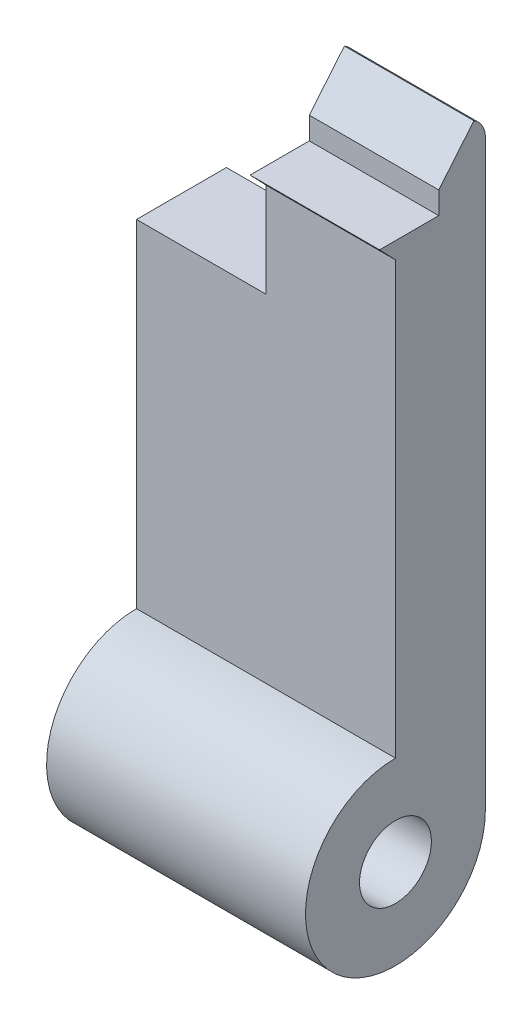
ISO-10303-21;
HEADER;
FILE_DESCRIPTION(('STEP AP214'),'2;1');
FILE_NAME('part.step','',(''),(''),'','','');
FILE_SCHEMA(('AUTOMOTIVE_DESIGN { 1 0 10303 214 1 1 1 1 }'));
ENDSEC;
DATA;
#1=APPLICATION_CONTEXT('core data for automotive mechanical design processes');
#2=APPLICATION_PROTOCOL_DEFINITION('international standard','automotive_design',2000,#1);
#3=PRODUCT_CONTEXT('',#1,'mechanical');
#4=PRODUCT('Part','Part','',(#3));
#5=PRODUCT_RELATED_PRODUCT_CATEGORY('part','',(#4));
#6=PRODUCT_DEFINITION_FORMATION('','',#4);
#7=PRODUCT_DEFINITION_CONTEXT('part definition',#1,'design');
#8=PRODUCT_DEFINITION('design','',#6,#7);
#9=PRODUCT_DEFINITION_SHAPE('','',#8);
#10=(LENGTH_UNIT() NAMED_UNIT(*) SI_UNIT(.MILLI.,.METRE.));
#11=(NAMED_UNIT(*) PLANE_ANGLE_UNIT() SI_UNIT($,.RADIAN.));
#12=(NAMED_UNIT(*) SI_UNIT($,.STERADIAN.) SOLID_ANGLE_UNIT());
#13=UNCERTAINTY_MEASURE_WITH_UNIT(LENGTH_MEASURE(1.E-05),#10,'distance_accuracy_value','');
#14=(GEOMETRIC_REPRESENTATION_CONTEXT(3) GLOBAL_UNCERTAINTY_ASSIGNED_CONTEXT((#13)) GLOBAL_UNIT_ASSIGNED_CONTEXT((#10,
#11,#12)) REPRESENTATION_CONTEXT('',''));
#15=CARTESIAN_POINT('',(0.,0.,0.));
#16=DIRECTION('',(0.,0.,1.));
#17=DIRECTION('',(1.,0.,0.));
#18=AXIS2_PLACEMENT_3D('',#15,#16,#17);
#19=CARTESIAN_POINT('',(9.144,0.,-1.52985296960418));
#20=DIRECTION('',(0.,0.,1.));
#21=DIRECTION('',(1.,0.,0.));
#22=AXIS2_PLACEMENT_3D('',#19,#20,#21);
#23=PLANE('',#22);
#24=DIRECTION('',(0.,1.,0.));
#25=VECTOR('',#24,1.);
#26=CARTESIAN_POINT('',(4.572,0.,-1.52985296960418));
#27=LINE('',#26,#25);
#28=CARTESIAN_POINT('',(4.572,19.000960284167,-1.52985296960418));
#29=VERTEX_POINT('',#28);
#30=CARTESIAN_POINT('',(4.572,19.7874801420835,-1.52985296960417));
#31=VERTEX_POINT('',#30);
#32=EDGE_CURVE('E187',#29,#31,#27,.T.);
#33=ORIENTED_EDGE('',*,*,#32,.F.);
#34=DIRECTION('',(-1.,0.,0.));
#35=VECTOR('',#34,1.);
#36=CARTESIAN_POINT('',(9.144,19.000960284167,-1.52985296960418));
#37=LINE('',#36,#35);
#38=CARTESIAN_POINT('',(9.144,19.000960284167,-1.52985296960418));
#39=VERTEX_POINT('',#38);
#40=EDGE_CURVE('E83',#39,#29,#37,.T.);
#41=ORIENTED_EDGE('',*,*,#40,.F.);
#42=DIRECTION('',(0.,1.,0.));
#43=VECTOR('',#42,1.);
#44=CARTESIAN_POINT('',(9.144,0.,-1.52985296960418));
#45=LINE('',#44,#43);
#46=CARTESIAN_POINT('',(9.144,19.7874801420835,-1.52985296960418));
#47=VERTEX_POINT('',#46);
#48=EDGE_CURVE('E144',#39,#47,#45,.T.);
#49=ORIENTED_EDGE('',*,*,#48,.T.);
#50=DIRECTION('',(-1.,0.,0.));
#51=VECTOR('',#50,1.);
#52=CARTESIAN_POINT('',(9.144,19.7874801420835,-1.52985296960418));
#53=LINE('',#52,#51);
#54=EDGE_CURVE('E132',#47,#31,#53,.T.);
#55=ORIENTED_EDGE('',*,*,#54,.T.);
#56=EDGE_LOOP('',(#33,#41,#49,#55));
#57=FACE_BOUND('',#56,.T.);
#58=ADVANCED_FACE('F35',(#57),#23,.T.);
#59=CARTESIAN_POINT('',(9.144,19.000960284167,0.));
#60=DIRECTION('',(0.,-1.,0.));
#61=DIRECTION('',(0.,0.,-1.));
#62=AXIS2_PLACEMENT_3D('',#59,#60,#61);
#63=PLANE('',#62);
#64=ORIENTED_EDGE('',*,*,#40,.T.);
#65=DIRECTION('',(0.,0.,1.));
#66=VECTOR('',#65,1.);
#67=CARTESIAN_POINT('',(4.572,19.000960284167,0.));
#68=LINE('',#67,#66);
#69=CARTESIAN_POINT('',(4.572,19.000960284167,0.561351088179941));
#70=VERTEX_POINT('',#69);
#71=EDGE_CURVE('E184',#29,#70,#68,.T.);
#72=ORIENTED_EDGE('',*,*,#71,.T.);
#73=DIRECTION('',(-1.,0.,0.));
#74=VECTOR('',#73,1.);
#75=CARTESIAN_POINT('',(9.144,19.000960284167,0.561351088179941));
#76=LINE('',#75,#74);
#77=CARTESIAN_POINT('',(9.144,19.000960284167,0.561351088179941));
#78=VERTEX_POINT('',#77);
#79=EDGE_CURVE('E154',#78,#70,#76,.T.);
#80=ORIENTED_EDGE('',*,*,#79,.F.);
#81=DIRECTION('',(0.,0.,1.));
#82=VECTOR('',#81,1.);
#83=CARTESIAN_POINT('',(9.144,19.000960284167,0.));
#84=LINE('',#83,#82);
#85=EDGE_CURVE('E174',#39,#78,#84,.T.);
#86=ORIENTED_EDGE('',*,*,#85,.F.);
#87=EDGE_LOOP('',(#64,#72,#80,#86));
#88=FACE_BOUND('',#87,.T.);
#89=ADVANCED_FACE('F228',(#88),#63,.F.);
#90=CARTESIAN_POINT('',(9.144,8.81269005290307,-9.19903154444387));
#91=DIRECTION('',(0.,-0.691780612318571,0.722107737404982));
#92=DIRECTION('',(0.,-0.722107737404982,-0.691780612318571));
#93=AXIS2_PLACEMENT_3D('',#90,#91,#92);
#94=PLANE('',#93);
#95=DIRECTION('',(0.,0.722107737404982,0.691780612318571));
#96=VECTOR('',#95,1.);
#97=CARTESIAN_POINT('',(4.572,8.81269005290307,-9.19903154444387));
#98=LINE('',#97,#96);
#99=CARTESIAN_POINT('',(4.572,18.415,0.));
#100=VERTEX_POINT('',#99);
#101=EDGE_CURVE('E181',#100,#70,#98,.T.);
#102=ORIENTED_EDGE('',*,*,#101,.F.);
#103=DIRECTION('',(-1.,0.,0.));
#104=VECTOR('',#103,1.);
#105=CARTESIAN_POINT('',(9.144,18.415,0.));
#106=LINE('',#105,#104);
#107=CARTESIAN_POINT('',(9.144,18.415,0.));
#108=VERTEX_POINT('',#107);
#109=EDGE_CURVE('E151',#108,#100,#106,.T.);
#110=ORIENTED_EDGE('',*,*,#109,.F.);
#111=DIRECTION('',(0.,0.722107737404982,0.691780612318571));
#112=VECTOR('',#111,1.);
#113=CARTESIAN_POINT('',(9.144,8.81269005290307,-9.19903154444387));
#114=LINE('',#113,#112);
#115=EDGE_CURVE('E171',#108,#78,#114,.T.);
#116=ORIENTED_EDGE('',*,*,#115,.T.);
#117=ORIENTED_EDGE('',*,*,#79,.T.);
#118=EDGE_LOOP('',(#102,#110,#116,#117));
#119=FACE_BOUND('',#118,.T.);
#120=ADVANCED_FACE('F218',(#119),#94,.T.);
#121=CARTESIAN_POINT('',(9.144,0.,0.));
#122=DIRECTION('',(0.,0.,1.));
#123=DIRECTION('',(1.,0.,0.));
#124=AXIS2_PLACEMENT_3D('',#121,#122,#123);
#125=PLANE('',#124);
#126=DIRECTION('',(0.,1.,0.));
#127=VECTOR('',#126,1.);
#128=CARTESIAN_POINT('',(4.572,0.,0.));
#129=LINE('',#128,#127);
#130=CARTESIAN_POINT('',(4.572,15.0775690128072,0.));
#131=VERTEX_POINT('',#130);
#132=EDGE_CURVE('E136',#131,#100,#129,.T.);
#133=ORIENTED_EDGE('',*,*,#132,.F.);
#134=DIRECTION('',(1.,0.,0.));
#135=VECTOR('',#134,1.);
#136=CARTESIAN_POINT('',(9.144,15.0775690128072,0.));
#137=LINE('',#136,#135);
#138=CARTESIAN_POINT('',(0.,15.0775690128072,0.));
#139=VERTEX_POINT('',#138);
#140=EDGE_CURVE('E193',#139,#131,#137,.T.);
#141=ORIENTED_EDGE('',*,*,#140,.F.);
#142=DIRECTION('',(0.,1.,0.));
#143=VECTOR('',#142,1.);
#144=CARTESIAN_POINT('',(0.,0.,0.));
#145=LINE('',#144,#143);
#146=CARTESIAN_POINT('',(0.,3.175,0.));
#147=VERTEX_POINT('',#146);
#148=EDGE_CURVE('E133',#147,#139,#145,.T.);
#149=ORIENTED_EDGE('',*,*,#148,.F.);
#150=DIRECTION('',(-1.,0.,0.));
#151=VECTOR('',#150,1.);
#152=CARTESIAN_POINT('',(9.144,3.175,0.));
#153=LINE('',#152,#151);
#154=CARTESIAN_POINT('',(9.144,3.175,0.));
#155=VERTEX_POINT('',#154);
#156=EDGE_CURVE('E149',#155,#147,#153,.T.);
#157=ORIENTED_EDGE('',*,*,#156,.F.);
#158=DIRECTION('',(0.,1.,0.));
#159=VECTOR('',#158,1.);
#160=CARTESIAN_POINT('',(9.144,0.,0.));
#161=LINE('',#160,#159);
#162=EDGE_CURVE('E167',#155,#108,#161,.T.);
#163=ORIENTED_EDGE('',*,*,#162,.T.);
#164=ORIENTED_EDGE('',*,*,#109,.T.);
#165=EDGE_LOOP('',(#133,#141,#149,#157,#163,#164));
#166=FACE_BOUND('',#165,.T.);
#167=ADVANCED_FACE('F220',(#166),#125,.T.);
#168=CARTESIAN_POINT('',(9.144,0.,0.));
#169=DIRECTION('',(-1.,0.,0.));
#170=DIRECTION('',(0.,0.,1.));
#171=AXIS2_PLACEMENT_3D('',#168,#169,#170);
#172=CYLINDRICAL_SURFACE('',#171,3.175);
#173=CARTESIAN_POINT('',(0.,0.,0.));
#174=DIRECTION('',(1.,0.,0.));
#175=DIRECTION('',(0.,0.,-1.));
#176=AXIS2_PLACEMENT_3D('',#173,#174,#175);
#177=CIRCLE('',#176,3.175);
#178=CARTESIAN_POINT('',(0.,0.,-3.175));
#179=VERTEX_POINT('',#178);
#180=EDGE_CURVE('E74',#147,#179,#177,.T.);
#181=ORIENTED_EDGE('',*,*,#180,.T.);
#182=DIRECTION('',(-1.,0.,0.));
#183=VECTOR('',#182,1.);
#184=CARTESIAN_POINT('',(9.144,0.,-3.175));
#185=LINE('',#184,#183);
#186=CARTESIAN_POINT('',(9.144,0.,-3.175));
#187=VERTEX_POINT('',#186);
#188=EDGE_CURVE('E120',#187,#179,#185,.T.);
#189=ORIENTED_EDGE('',*,*,#188,.F.);
#190=CARTESIAN_POINT('',(9.144,0.,0.));
#191=DIRECTION('',(1.,0.,0.));
#192=DIRECTION('',(0.,0.,-1.));
#193=AXIS2_PLACEMENT_3D('',#190,#191,#192);
#194=CIRCLE('',#193,3.175);
#195=EDGE_CURVE('E108',#155,#187,#194,.T.);
#196=ORIENTED_EDGE('',*,*,#195,.F.);
#197=ORIENTED_EDGE('',*,*,#156,.T.);
#198=EDGE_LOOP('',(#181,#189,#196,#197));
#199=FACE_BOUND('',#198,.T.);
#200=ADVANCED_FACE('F166',(#199),#172,.T.);
#201=CARTESIAN_POINT('',(9.144,0.,-3.175));
#202=DIRECTION('',(0.,0.,1.));
#203=DIRECTION('',(1.,0.,0.));
#204=AXIS2_PLACEMENT_3D('',#201,#202,#203);
#205=PLANE('',#204);
#206=DIRECTION('',(-1.,0.,0.));
#207=VECTOR('',#206,1.);
#208=CARTESIAN_POINT('',(4.572,15.0775690128072,-3.175));
#209=LINE('',#208,#207);
#210=CARTESIAN_POINT('',(4.572,15.0775690128072,-3.175));
#211=VERTEX_POINT('',#210);
#212=CARTESIAN_POINT('',(0.,15.0775690128072,-3.175));
#213=VERTEX_POINT('',#212);
#214=EDGE_CURVE('E49',#211,#213,#209,.T.);
#215=ORIENTED_EDGE('',*,*,#214,.F.);
#216=DIRECTION('',(0.,-1.,0.));
#217=VECTOR('',#216,1.);
#218=CARTESIAN_POINT('',(4.572,22.586192510525,-3.175));
#219=LINE('',#218,#217);
#220=CARTESIAN_POINT('',(4.572,20.574,-3.175));
#221=VERTEX_POINT('',#220);
#222=EDGE_CURVE('E117',#221,#211,#219,.T.);
#223=ORIENTED_EDGE('',*,*,#222,.F.);
#224=DIRECTION('',(-1.,0.,0.));
#225=VECTOR('',#224,1.);
#226=CARTESIAN_POINT('',(9.144,20.574,-3.175));
#227=LINE('',#226,#225);
#228=CARTESIAN_POINT('',(9.144,20.574,-3.175));
#229=VERTEX_POINT('',#228);
#230=EDGE_CURVE('E113',#229,#221,#227,.T.);
#231=ORIENTED_EDGE('',*,*,#230,.F.);
#232=DIRECTION('',(0.,1.,0.));
#233=VECTOR('',#232,1.);
#234=CARTESIAN_POINT('',(9.144,0.,-3.175));
#235=LINE('',#234,#233);
#236=EDGE_CURVE('E100',#187,#229,#235,.T.);
#237=ORIENTED_EDGE('',*,*,#236,.F.);
#238=ORIENTED_EDGE('',*,*,#188,.T.);
#239=DIRECTION('',(0.,1.,0.));
#240=VECTOR('',#239,1.);
#241=CARTESIAN_POINT('',(0.,0.,-3.175));
#242=LINE('',#241,#240);
#243=EDGE_CURVE('E138',#179,#213,#242,.T.);
#244=ORIENTED_EDGE('',*,*,#243,.T.);
#245=EDGE_LOOP('',(#215,#223,#231,#237,#238,#244));
#246=FACE_BOUND('',#245,.T.);
#247=ADVANCED_FACE('F114',(#246),#205,.F.);
#248=CARTESIAN_POINT('',(9.144,20.574,-2.35242648480209));
#249=DIRECTION('',(-1.,0.,0.));
#250=DIRECTION('',(0.,0.,1.));
#251=AXIS2_PLACEMENT_3D('',#248,#249,#250);
#252=CYLINDRICAL_SURFACE('',#251,0.822573515197912);
#253=CARTESIAN_POINT('',(4.572,20.574,-2.35242648480209));
#254=DIRECTION('',(1.,0.,0.));
#255=DIRECTION('',(0.,0.,-1.));
#256=AXIS2_PLACEMENT_3D('',#253,#254,#255);
#257=CIRCLE('',#256,0.822573515197912);
#258=CARTESIAN_POINT('',(4.572,21.2824031479205,-2.77050801742632));
#259=VERTEX_POINT('',#258);
#260=EDGE_CURVE('E190',#259,#221,#257,.F.);
#261=ORIENTED_EDGE('',*,*,#260,.F.);
#262=DIRECTION('',(-1.,0.,0.));
#263=VECTOR('',#262,1.);
#264=CARTESIAN_POINT('',(9.144,21.2824031479205,-2.77050801742632));
#265=LINE('',#264,#263);
#266=CARTESIAN_POINT('',(9.144,21.2824031479205,-2.77050801742632));
#267=VERTEX_POINT('',#266);
#268=EDGE_CURVE('E121',#267,#259,#265,.T.);
#269=ORIENTED_EDGE('',*,*,#268,.F.);
#270=CARTESIAN_POINT('',(9.144,20.574,-2.35242648480209));
#271=DIRECTION('',(1.,0.,0.));
#272=DIRECTION('',(0.,0.,-1.));
#273=AXIS2_PLACEMENT_3D('',#270,#271,#272);
#274=CIRCLE('',#273,0.822573515197912);
#275=EDGE_CURVE('E105',#267,#229,#274,.F.);
#276=ORIENTED_EDGE('',*,*,#275,.T.);
#277=ORIENTED_EDGE('',*,*,#230,.T.);
#278=EDGE_LOOP('',(#261,#269,#276,#277));
#279=FACE_BOUND('',#278,.T.);
#280=ADVANCED_FACE('F123',(#279),#252,.T.);
#281=CARTESIAN_POINT('',(9.144,7.31845393063113,8.81834573378265));
#282=DIRECTION('',(0.,-0.638629481227086,-0.769514383041424));
#283=DIRECTION('',(0.,0.769514383041424,-0.638629481227086));
#284=AXIS2_PLACEMENT_3D('',#281,#282,#283);
#285=PLANE('',#284);
#286=ORIENTED_EDGE('',*,*,#268,.T.);
#287=DIRECTION('',(0.,-0.769514383041424,0.638629481227086));
#288=VECTOR('',#287,1.);
#289=CARTESIAN_POINT('',(4.572,7.31845393063113,8.81834573378265));
#290=LINE('',#289,#288);
#291=EDGE_CURVE('E11',#259,#31,#290,.T.);
#292=ORIENTED_EDGE('',*,*,#291,.T.);
#293=ORIENTED_EDGE('',*,*,#54,.F.);
#294=DIRECTION('',(0.,-0.769514383041424,0.638629481227086));
#295=VECTOR('',#294,1.);
#296=CARTESIAN_POINT('',(9.144,7.31845393063113,8.81834573378265));
#297=LINE('',#296,#295);
#298=EDGE_CURVE('E58',#267,#47,#297,.T.);
#299=ORIENTED_EDGE('',*,*,#298,.F.);
#300=EDGE_LOOP('',(#286,#292,#293,#299));
#301=FACE_BOUND('',#300,.T.);
#302=ADVANCED_FACE('F236',(#301),#285,.F.);
#303=CARTESIAN_POINT('',(9.144,0.,0.));
#304=DIRECTION('',(-1.,0.,0.));
#305=DIRECTION('',(0.,0.,1.));
#306=AXIS2_PLACEMENT_3D('',#303,#304,#305);
#307=CYLINDRICAL_SURFACE('',#306,1.27);
#308=CARTESIAN_POINT('',(9.144,0.,0.));
#309=DIRECTION('',(1.,0.,0.));
#310=DIRECTION('',(0.,0.,-1.));
#311=AXIS2_PLACEMENT_3D('',#308,#309,#310);
#312=CIRCLE('',#311,1.27);
#313=CARTESIAN_POINT('',(9.144,0.,-1.27));
#314=VERTEX_POINT('',#313);
#315=EDGE_CURVE('E126',#314,#314,#312,.T.);
#316=ORIENTED_EDGE('',*,*,#315,.T.);
#317=EDGE_LOOP('',(#316));
#318=FACE_BOUND('',#317,.T.);
#319=CARTESIAN_POINT('',(0.,0.,0.));
#320=DIRECTION('',(1.,0.,0.));
#321=DIRECTION('',(0.,0.,-1.));
#322=AXIS2_PLACEMENT_3D('',#319,#320,#321);
#323=CIRCLE('',#322,1.27);
#324=CARTESIAN_POINT('',(0.,0.,-1.27));
#325=VERTEX_POINT('',#324);
#326=EDGE_CURVE('E141',#325,#325,#323,.T.);
#327=ORIENTED_EDGE('',*,*,#326,.F.);
#328=EDGE_LOOP('',(#327));
#329=FACE_BOUND('',#328,.T.);
#330=ADVANCED_FACE('F238',(#318,#329),#307,.F.);
#331=CARTESIAN_POINT('',(9.144,0.,0.));
#332=DIRECTION('',(1.,0.,0.));
#333=DIRECTION('',(0.,0.,-1.));
#334=AXIS2_PLACEMENT_3D('',#331,#332,#333);
#335=PLANE('',#334);
#336=ORIENTED_EDGE('',*,*,#48,.F.);
#337=ORIENTED_EDGE('',*,*,#85,.T.);
#338=ORIENTED_EDGE('',*,*,#115,.F.);
#339=ORIENTED_EDGE('',*,*,#162,.F.);
#340=ORIENTED_EDGE('',*,*,#195,.T.);
#341=ORIENTED_EDGE('',*,*,#236,.T.);
#342=ORIENTED_EDGE('',*,*,#275,.F.);
#343=ORIENTED_EDGE('',*,*,#298,.T.);
#344=EDGE_LOOP('',(#336,#337,#338,#339,#340,#341,#342,#343));
#345=FACE_BOUND('',#344,.T.);
#346=ORIENTED_EDGE('',*,*,#315,.F.);
#347=EDGE_LOOP('',(#346));
#348=FACE_BOUND('',#347,.T.);
#349=ADVANCED_FACE('F102',(#345,#348),#335,.T.);
#350=CARTESIAN_POINT('',(0.,0.,0.));
#351=DIRECTION('',(1.,0.,0.));
#352=DIRECTION('',(0.,0.,-1.));
#353=AXIS2_PLACEMENT_3D('',#350,#351,#352);
#354=PLANE('',#353);
#355=ORIENTED_EDGE('',*,*,#148,.T.);
#356=DIRECTION('',(0.,0.,-1.));
#357=VECTOR('',#356,1.);
#358=CARTESIAN_POINT('',(0.,15.0775690128072,0.));
#359=LINE('',#358,#357);
#360=EDGE_CURVE('E42',#139,#213,#359,.T.);
#361=ORIENTED_EDGE('',*,*,#360,.T.);
#362=ORIENTED_EDGE('',*,*,#243,.F.);
#363=ORIENTED_EDGE('',*,*,#180,.F.);
#364=EDGE_LOOP('',(#355,#361,#362,#363));
#365=FACE_BOUND('',#364,.T.);
#366=ORIENTED_EDGE('',*,*,#326,.T.);
#367=EDGE_LOOP('',(#366));
#368=FACE_BOUND('',#367,.T.);
#369=ADVANCED_FACE('F159',(#365,#368),#354,.F.);
#370=CARTESIAN_POINT('',(4.572,22.586192510525,3.175));
#371=DIRECTION('',(1.,0.,0.));
#372=DIRECTION('',(0.,0.,-1.));
#373=AXIS2_PLACEMENT_3D('',#370,#371,#372);
#374=PLANE('',#373);
#375=ORIENTED_EDGE('',*,*,#132,.T.);
#376=ORIENTED_EDGE('',*,*,#101,.T.);
#377=ORIENTED_EDGE('',*,*,#71,.F.);
#378=ORIENTED_EDGE('',*,*,#32,.T.);
#379=ORIENTED_EDGE('',*,*,#291,.F.);
#380=ORIENTED_EDGE('',*,*,#260,.T.);
#381=ORIENTED_EDGE('',*,*,#222,.T.);
#382=DIRECTION('',(0.,0.,-1.));
#383=VECTOR('',#382,1.);
#384=CARTESIAN_POINT('',(4.572,15.0775690128072,3.175));
#385=LINE('',#384,#383);
#386=EDGE_CURVE('E195',#131,#211,#385,.T.);
#387=ORIENTED_EDGE('',*,*,#386,.F.);
#388=EDGE_LOOP('',(#375,#376,#377,#378,#379,#380,#381,#387));
#389=FACE_BOUND('',#388,.T.);
#390=ADVANCED_FACE('F200',(#389),#374,.F.);
#391=CARTESIAN_POINT('',(4.572,15.0775690128072,3.175));
#392=DIRECTION('',(0.,-1.,0.));
#393=DIRECTION('',(0.,0.,-1.));
#394=AXIS2_PLACEMENT_3D('',#391,#392,#393);
#395=PLANE('',#394);
#396=ORIENTED_EDGE('',*,*,#140,.T.);
#397=ORIENTED_EDGE('',*,*,#386,.T.);
#398=ORIENTED_EDGE('',*,*,#214,.T.);
#399=ORIENTED_EDGE('',*,*,#360,.F.);
#400=EDGE_LOOP('',(#396,#397,#398,#399));
#401=FACE_BOUND('',#400,.T.);
#402=ADVANCED_FACE('F281',(#401),#395,.F.);
#403=CLOSED_SHELL('',(#58,#89,#120,#167,#200,#247,#280,#302,#330,#349,#369,#390,#402));
#404=MANIFOLD_SOLID_BREP('B2',#403);
#405=ADVANCED_BREP_SHAPE_REPRESENTATION('',(#18,#404),#14);
#406=SHAPE_DEFINITION_REPRESENTATION(#9,#405);
ENDSEC;
END-ISO-10303-21;
